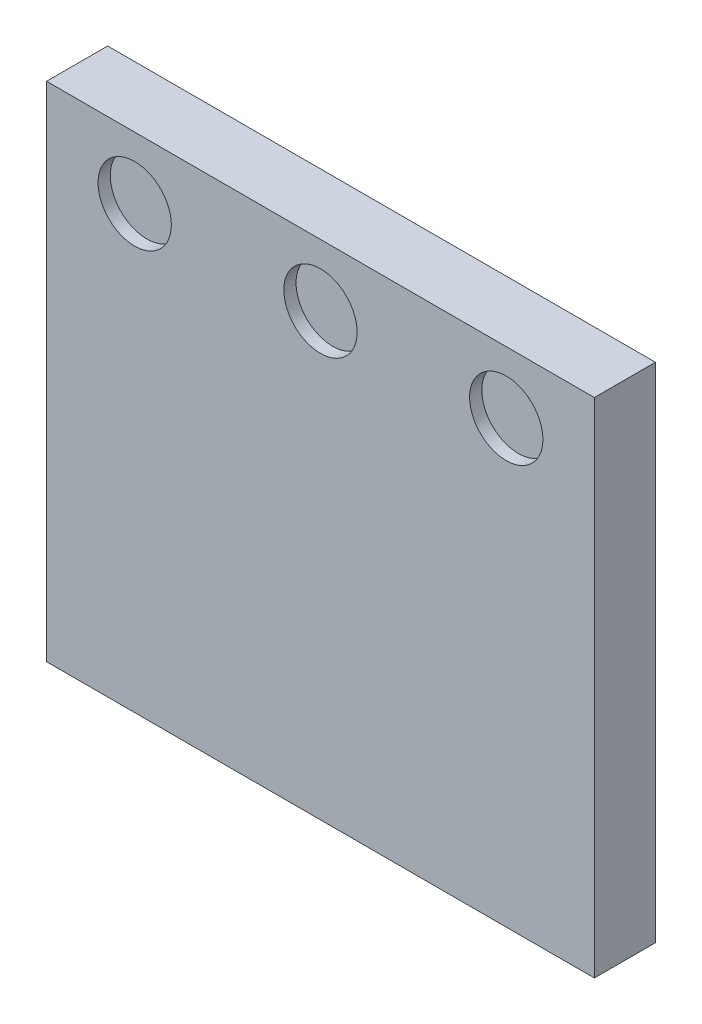
ISO-10303-21;
HEADER;
FILE_DESCRIPTION(('STEP AP214'),'2;1');
FILE_NAME('part.step','',(''),(''),'','','');
FILE_SCHEMA(('AUTOMOTIVE_DESIGN { 1 0 10303 214 1 1 1 1 }'));
ENDSEC;
DATA;
#1=APPLICATION_CONTEXT('core data for automotive mechanical design processes');
#2=APPLICATION_PROTOCOL_DEFINITION('international standard','automotive_design',2000,#1);
#3=PRODUCT_CONTEXT('',#1,'mechanical');
#4=PRODUCT('Part','Part','',(#3));
#5=PRODUCT_RELATED_PRODUCT_CATEGORY('part','',(#4));
#6=PRODUCT_DEFINITION_FORMATION('','',#4);
#7=PRODUCT_DEFINITION_CONTEXT('part definition',#1,'design');
#8=PRODUCT_DEFINITION('design','',#6,#7);
#9=PRODUCT_DEFINITION_SHAPE('','',#8);
#10=(LENGTH_UNIT() NAMED_UNIT(*) SI_UNIT(.MILLI.,.METRE.));
#11=(NAMED_UNIT(*) PLANE_ANGLE_UNIT() SI_UNIT($,.RADIAN.));
#12=(NAMED_UNIT(*) SI_UNIT($,.STERADIAN.) SOLID_ANGLE_UNIT());
#13=UNCERTAINTY_MEASURE_WITH_UNIT(LENGTH_MEASURE(1.E-05),#10,'distance_accuracy_value','');
#14=(GEOMETRIC_REPRESENTATION_CONTEXT(3) GLOBAL_UNCERTAINTY_ASSIGNED_CONTEXT((#13)) GLOBAL_UNIT_ASSIGNED_CONTEXT((#10,
#11,#12)) REPRESENTATION_CONTEXT('',''));
#15=CARTESIAN_POINT('',(0.,0.,0.));
#16=DIRECTION('',(0.,0.,1.));
#17=DIRECTION('',(1.,0.,0.));
#18=AXIS2_PLACEMENT_3D('',#15,#16,#17);
#19=CARTESIAN_POINT('',(44.8378350355877,41.1483516174769,10.));
#20=DIRECTION('',(-1.,0.,0.));
#21=DIRECTION('',(0.,0.,1.));
#22=AXIS2_PLACEMENT_3D('',#19,#20,#21);
#23=PLANE('',#22);
#24=DIRECTION('',(0.,1.,0.));
#25=VECTOR('',#24,1.);
#26=CARTESIAN_POINT('',(44.8378350355877,41.1483516174769,0.));
#27=LINE('',#26,#25);
#28=CARTESIAN_POINT('',(44.8378350355877,-41.1483516174769,0.));
#29=VERTEX_POINT('',#28);
#30=CARTESIAN_POINT('',(44.8378350355877,41.1483516174769,0.));
#31=VERTEX_POINT('',#30);
#32=EDGE_CURVE('E113',#29,#31,#27,.T.);
#33=ORIENTED_EDGE('',*,*,#32,.T.);
#34=DIRECTION('',(0.,0.,-1.));
#35=VECTOR('',#34,1.);
#36=CARTESIAN_POINT('',(44.8378350355877,41.1483516174769,10.));
#37=LINE('',#36,#35);
#38=CARTESIAN_POINT('',(44.8378350355877,41.1483516174769,10.));
#39=VERTEX_POINT('',#38);
#40=EDGE_CURVE('E11',#39,#31,#37,.T.);
#41=ORIENTED_EDGE('',*,*,#40,.F.);
#42=DIRECTION('',(0.,1.,0.));
#43=VECTOR('',#42,1.);
#44=CARTESIAN_POINT('',(44.8378350355877,41.1483516174769,10.));
#45=LINE('',#44,#43);
#46=CARTESIAN_POINT('',(44.8378350355877,-41.1483516174769,10.));
#47=VERTEX_POINT('',#46);
#48=EDGE_CURVE('E97',#47,#39,#45,.T.);
#49=ORIENTED_EDGE('',*,*,#48,.F.);
#50=DIRECTION('',(0.,0.,-1.));
#51=VECTOR('',#50,1.);
#52=CARTESIAN_POINT('',(44.8378350355877,-41.1483516174769,10.));
#53=LINE('',#52,#51);
#54=EDGE_CURVE('E109',#47,#29,#53,.T.);
#55=ORIENTED_EDGE('',*,*,#54,.T.);
#56=EDGE_LOOP('',(#33,#41,#49,#55));
#57=FACE_BOUND('',#56,.T.);
#58=ADVANCED_FACE('F45',(#57),#23,.F.);
#59=CARTESIAN_POINT('',(-44.8378350355877,41.1483516174769,10.));
#60=DIRECTION('',(0.,-1.,0.));
#61=DIRECTION('',(0.,0.,-1.));
#62=AXIS2_PLACEMENT_3D('',#59,#60,#61);
#63=PLANE('',#62);
#64=DIRECTION('',(-1.,0.,0.));
#65=VECTOR('',#64,1.);
#66=CARTESIAN_POINT('',(-44.8378350355877,41.1483516174769,0.));
#67=LINE('',#66,#65);
#68=CARTESIAN_POINT('',(-44.8378350355877,41.1483516174769,0.));
#69=VERTEX_POINT('',#68);
#70=EDGE_CURVE('E102',#31,#69,#67,.T.);
#71=ORIENTED_EDGE('',*,*,#70,.T.);
#72=DIRECTION('',(0.,0.,-1.));
#73=VECTOR('',#72,1.);
#74=CARTESIAN_POINT('',(-44.8378350355877,41.1483516174769,10.));
#75=LINE('',#74,#73);
#76=CARTESIAN_POINT('',(-44.8378350355877,41.1483516174769,10.));
#77=VERTEX_POINT('',#76);
#78=EDGE_CURVE('E54',#77,#69,#75,.T.);
#79=ORIENTED_EDGE('',*,*,#78,.F.);
#80=DIRECTION('',(-1.,0.,0.));
#81=VECTOR('',#80,1.);
#82=CARTESIAN_POINT('',(-44.8378350355877,41.1483516174769,10.));
#83=LINE('',#82,#81);
#84=EDGE_CURVE('E92',#39,#77,#83,.T.);
#85=ORIENTED_EDGE('',*,*,#84,.F.);
#86=ORIENTED_EDGE('',*,*,#40,.T.);
#87=EDGE_LOOP('',(#71,#79,#85,#86));
#88=FACE_BOUND('',#87,.T.);
#89=ADVANCED_FACE('F101',(#88),#63,.F.);
#90=CARTESIAN_POINT('',(-44.8378350355877,41.1483516174769,10.));
#91=DIRECTION('',(1.,0.,0.));
#92=DIRECTION('',(0.,0.,-1.));
#93=AXIS2_PLACEMENT_3D('',#90,#91,#92);
#94=PLANE('',#93);
#95=DIRECTION('',(0.,-1.,0.));
#96=VECTOR('',#95,1.);
#97=CARTESIAN_POINT('',(-44.8378350355877,41.1483516174769,0.));
#98=LINE('',#97,#96);
#99=CARTESIAN_POINT('',(-44.8378350355877,-41.1483516174769,0.));
#100=VERTEX_POINT('',#99);
#101=EDGE_CURVE('E79',#69,#100,#98,.T.);
#102=ORIENTED_EDGE('',*,*,#101,.T.);
#103=DIRECTION('',(0.,0.,-1.));
#104=VECTOR('',#103,1.);
#105=CARTESIAN_POINT('',(-44.8378350355877,-41.1483516174769,10.));
#106=LINE('',#105,#104);
#107=CARTESIAN_POINT('',(-44.8378350355877,-41.1483516174769,10.));
#108=VERTEX_POINT('',#107);
#109=EDGE_CURVE('E104',#108,#100,#106,.T.);
#110=ORIENTED_EDGE('',*,*,#109,.F.);
#111=DIRECTION('',(0.,-1.,0.));
#112=VECTOR('',#111,1.);
#113=CARTESIAN_POINT('',(-44.8378350355877,41.1483516174769,10.));
#114=LINE('',#113,#112);
#115=EDGE_CURVE('E95',#77,#108,#114,.T.);
#116=ORIENTED_EDGE('',*,*,#115,.F.);
#117=ORIENTED_EDGE('',*,*,#78,.T.);
#118=EDGE_LOOP('',(#102,#110,#116,#117));
#119=FACE_BOUND('',#118,.T.);
#120=ADVANCED_FACE('F105',(#119),#94,.F.);
#121=CARTESIAN_POINT('',(-44.8378350355877,-41.1483516174769,10.));
#122=DIRECTION('',(0.,1.,0.));
#123=DIRECTION('',(0.,0.,1.));
#124=AXIS2_PLACEMENT_3D('',#121,#122,#123);
#125=PLANE('',#124);
#126=DIRECTION('',(1.,0.,0.));
#127=VECTOR('',#126,1.);
#128=CARTESIAN_POINT('',(-44.8378350355877,-41.1483516174769,0.));
#129=LINE('',#128,#127);
#130=EDGE_CURVE('E85',#100,#29,#129,.T.);
#131=ORIENTED_EDGE('',*,*,#130,.T.);
#132=ORIENTED_EDGE('',*,*,#54,.F.);
#133=DIRECTION('',(1.,0.,0.));
#134=VECTOR('',#133,1.);
#135=CARTESIAN_POINT('',(-44.8378350355877,-41.1483516174769,10.));
#136=LINE('',#135,#134);
#137=EDGE_CURVE('E62',#108,#47,#136,.T.);
#138=ORIENTED_EDGE('',*,*,#137,.F.);
#139=ORIENTED_EDGE('',*,*,#109,.T.);
#140=EDGE_LOOP('',(#131,#132,#138,#139));
#141=FACE_BOUND('',#140,.T.);
#142=ADVANCED_FACE('F127',(#141),#125,.F.);
#143=CARTESIAN_POINT('',(0.,0.,10.));
#144=DIRECTION('',(0.,0.,1.));
#145=DIRECTION('',(1.,0.,0.));
#146=AXIS2_PLACEMENT_3D('',#143,#144,#145);
#147=PLANE('',#146);
#148=CARTESIAN_POINT('',(0.,30.9892891309745,10.));
#149=DIRECTION('',(0.,0.,1.));
#150=DIRECTION('',(1.,0.,0.));
#151=AXIS2_PLACEMENT_3D('',#148,#149,#150);
#152=CIRCLE('',#151,6.);
#153=CARTESIAN_POINT('',(6.,30.9892891309745,10.));
#154=VERTEX_POINT('',#153);
#155=EDGE_CURVE('E150',#154,#154,#152,.T.);
#156=ORIENTED_EDGE('',*,*,#155,.F.);
#157=EDGE_LOOP('',(#156));
#158=FACE_BOUND('',#157,.T.);
#159=CARTESIAN_POINT('',(-30.4118489608321,30.9892891309745,10.));
#160=DIRECTION('',(0.,0.,1.));
#161=DIRECTION('',(1.,0.,0.));
#162=AXIS2_PLACEMENT_3D('',#159,#160,#161);
#163=CIRCLE('',#162,6.);
#164=CARTESIAN_POINT('',(-24.4118489608321,30.9892891309745,10.));
#165=VERTEX_POINT('',#164);
#166=EDGE_CURVE('E143',#165,#165,#163,.T.);
#167=ORIENTED_EDGE('',*,*,#166,.F.);
#168=EDGE_LOOP('',(#167));
#169=FACE_BOUND('',#168,.T.);
#170=CARTESIAN_POINT('',(30.4118489608321,30.9892891309745,10.));
#171=DIRECTION('',(0.,0.,1.));
#172=DIRECTION('',(-1.,0.,0.));
#173=AXIS2_PLACEMENT_3D('',#170,#171,#172);
#174=CIRCLE('',#173,6.);
#175=CARTESIAN_POINT('',(24.4118489608321,30.9892891309745,10.));
#176=VERTEX_POINT('',#175);
#177=EDGE_CURVE('E138',#176,#176,#174,.T.);
#178=ORIENTED_EDGE('',*,*,#177,.F.);
#179=EDGE_LOOP('',(#178));
#180=FACE_BOUND('',#179,.T.);
#181=ORIENTED_EDGE('',*,*,#48,.T.);
#182=ORIENTED_EDGE('',*,*,#84,.T.);
#183=ORIENTED_EDGE('',*,*,#115,.T.);
#184=ORIENTED_EDGE('',*,*,#137,.T.);
#185=EDGE_LOOP('',(#181,#182,#183,#184));
#186=FACE_BOUND('',#185,.T.);
#187=ADVANCED_FACE('F93',(#158,#169,#180,#186),#147,.T.);
#188=CARTESIAN_POINT('',(0.,0.,0.));
#189=DIRECTION('',(0.,0.,1.));
#190=DIRECTION('',(1.,0.,0.));
#191=AXIS2_PLACEMENT_3D('',#188,#189,#190);
#192=PLANE('',#191);
#193=ORIENTED_EDGE('',*,*,#32,.F.);
#194=ORIENTED_EDGE('',*,*,#130,.F.);
#195=ORIENTED_EDGE('',*,*,#101,.F.);
#196=ORIENTED_EDGE('',*,*,#70,.F.);
#197=EDGE_LOOP('',(#193,#194,#195,#196));
#198=FACE_BOUND('',#197,.T.);
#199=ADVANCED_FACE('F130',(#198),#192,.F.);
#200=CARTESIAN_POINT('',(30.4118489608321,30.9892891309745,8.));
#201=DIRECTION('',(0.,0.,1.));
#202=DIRECTION('',(1.,0.,0.));
#203=AXIS2_PLACEMENT_3D('',#200,#201,#202);
#204=CYLINDRICAL_SURFACE('',#203,6.);
#205=CARTESIAN_POINT('',(30.4118489608321,30.9892891309745,8.));
#206=DIRECTION('',(0.,0.,1.));
#207=DIRECTION('',(-1.,0.,0.));
#208=AXIS2_PLACEMENT_3D('',#205,#206,#207);
#209=CIRCLE('',#208,6.);
#210=CARTESIAN_POINT('',(24.4118489608321,30.9892891309745,8.));
#211=VERTEX_POINT('',#210);
#212=EDGE_CURVE('E134',#211,#211,#209,.T.);
#213=ORIENTED_EDGE('',*,*,#212,.F.);
#214=EDGE_LOOP('',(#213));
#215=FACE_BOUND('',#214,.T.);
#216=ORIENTED_EDGE('',*,*,#177,.T.);
#217=EDGE_LOOP('',(#216));
#218=FACE_BOUND('',#217,.T.);
#219=ADVANCED_FACE('F174',(#215,#218),#204,.F.);
#220=CARTESIAN_POINT('',(30.4118489608321,30.9892891309745,8.));
#221=DIRECTION('',(0.,0.,-1.));
#222=DIRECTION('',(-1.,0.,0.));
#223=AXIS2_PLACEMENT_3D('',#220,#221,#222);
#224=PLANE('',#223);
#225=ORIENTED_EDGE('',*,*,#212,.T.);
#226=EDGE_LOOP('',(#225));
#227=FACE_BOUND('',#226,.T.);
#228=ADVANCED_FACE('F176',(#227),#224,.F.);
#229=CARTESIAN_POINT('',(-30.4118489608321,30.9892891309745,8.));
#230=DIRECTION('',(0.,0.,1.));
#231=DIRECTION('',(1.,0.,0.));
#232=AXIS2_PLACEMENT_3D('',#229,#230,#231);
#233=CYLINDRICAL_SURFACE('',#232,6.);
#234=CARTESIAN_POINT('',(-30.4118489608321,30.9892891309745,8.));
#235=DIRECTION('',(0.,0.,1.));
#236=DIRECTION('',(1.,0.,0.));
#237=AXIS2_PLACEMENT_3D('',#234,#235,#236);
#238=CIRCLE('',#237,6.);
#239=CARTESIAN_POINT('',(-24.4118489608321,30.9892891309745,8.));
#240=VERTEX_POINT('',#239);
#241=EDGE_CURVE('E117',#240,#240,#238,.T.);
#242=ORIENTED_EDGE('',*,*,#241,.F.);
#243=EDGE_LOOP('',(#242));
#244=FACE_BOUND('',#243,.T.);
#245=ORIENTED_EDGE('',*,*,#166,.T.);
#246=EDGE_LOOP('',(#245));
#247=FACE_BOUND('',#246,.T.);
#248=ADVANCED_FACE('F183',(#244,#247),#233,.F.);
#249=CARTESIAN_POINT('',(-30.4118489608321,30.9892891309745,8.));
#250=DIRECTION('',(0.,0.,1.));
#251=DIRECTION('',(1.,0.,0.));
#252=AXIS2_PLACEMENT_3D('',#249,#250,#251);
#253=PLANE('',#252);
#254=ORIENTED_EDGE('',*,*,#241,.T.);
#255=EDGE_LOOP('',(#254));
#256=FACE_BOUND('',#255,.T.);
#257=ADVANCED_FACE('F163',(#256),#253,.T.);
#258=CARTESIAN_POINT('',(0.,30.9892891309745,8.));
#259=DIRECTION('',(0.,0.,1.));
#260=DIRECTION('',(1.,0.,0.));
#261=AXIS2_PLACEMENT_3D('',#258,#259,#260);
#262=CYLINDRICAL_SURFACE('',#261,6.);
#263=CARTESIAN_POINT('',(0.,30.9892891309745,8.));
#264=DIRECTION('',(0.,0.,1.));
#265=DIRECTION('',(1.,0.,0.));
#266=AXIS2_PLACEMENT_3D('',#263,#264,#265);
#267=CIRCLE('',#266,6.);
#268=CARTESIAN_POINT('',(6.,30.9892891309745,8.));
#269=VERTEX_POINT('',#268);
#270=EDGE_CURVE('E139',#269,#269,#267,.T.);
#271=ORIENTED_EDGE('',*,*,#270,.F.);
#272=EDGE_LOOP('',(#271));
#273=FACE_BOUND('',#272,.T.);
#274=ORIENTED_EDGE('',*,*,#155,.T.);
#275=EDGE_LOOP('',(#274));
#276=FACE_BOUND('',#275,.T.);
#277=ADVANCED_FACE('F160',(#273,#276),#262,.F.);
#278=CARTESIAN_POINT('',(0.,30.9892891309745,8.));
#279=DIRECTION('',(0.,0.,1.));
#280=DIRECTION('',(1.,0.,0.));
#281=AXIS2_PLACEMENT_3D('',#278,#279,#280);
#282=PLANE('',#281);
#283=ORIENTED_EDGE('',*,*,#270,.T.);
#284=EDGE_LOOP('',(#283));
#285=FACE_BOUND('',#284,.T.);
#286=ADVANCED_FACE('F158',(#285),#282,.T.);
#287=CLOSED_SHELL('',(#58,#89,#120,#142,#187,#199,#219,#228,#248,#257,#277,#286));
#288=MANIFOLD_SOLID_BREP('B2',#287);
#289=ADVANCED_BREP_SHAPE_REPRESENTATION('',(#18,#288),#14);
#290=SHAPE_DEFINITION_REPRESENTATION(#9,#289);
ENDSEC;
END-ISO-10303-21;
